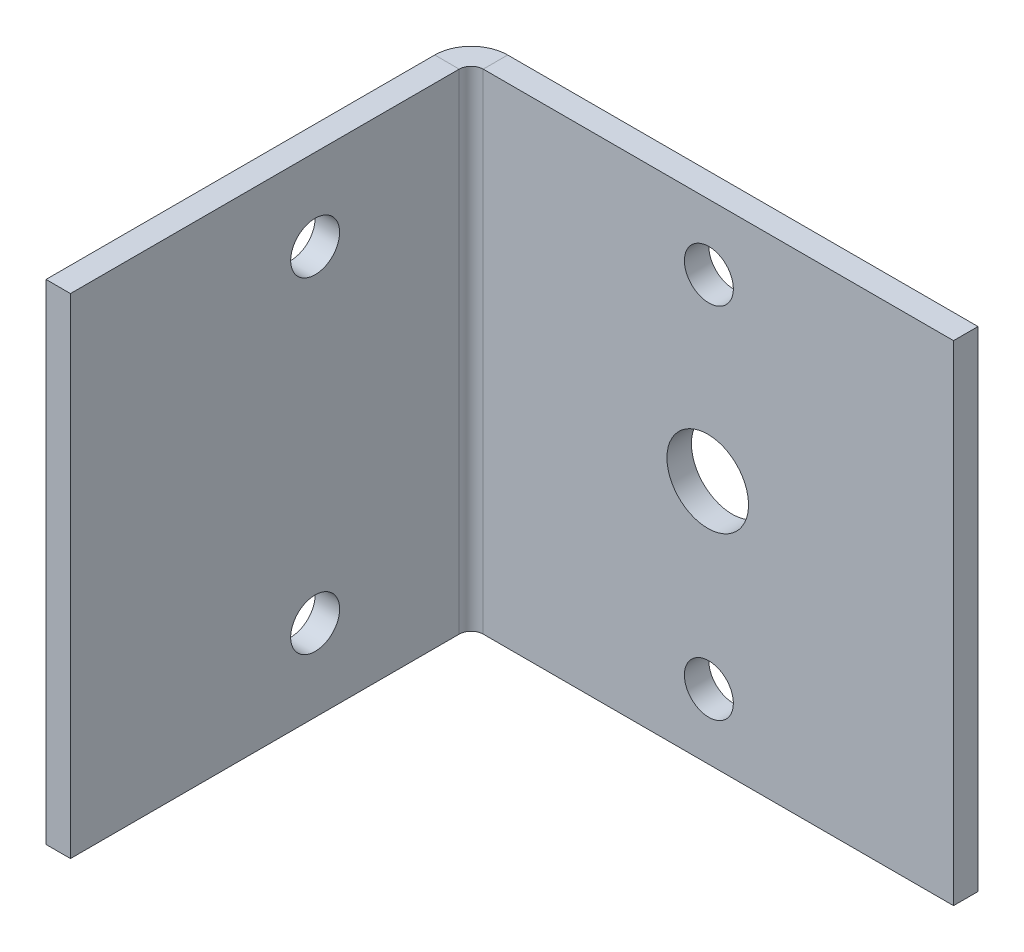
ISO-10303-21;
HEADER;
FILE_DESCRIPTION(('STEP AP214'),'2;1');
FILE_NAME('part.step','',(''),(''),'','','');
FILE_SCHEMA(('AUTOMOTIVE_DESIGN { 1 0 10303 214 1 1 1 1 }'));
ENDSEC;
DATA;
#1=APPLICATION_CONTEXT('core data for automotive mechanical design processes');
#2=APPLICATION_PROTOCOL_DEFINITION('international standard','automotive_design',2000,#1);
#3=PRODUCT_CONTEXT('',#1,'mechanical');
#4=PRODUCT('Part','Part','',(#3));
#5=PRODUCT_RELATED_PRODUCT_CATEGORY('part','',(#4));
#6=PRODUCT_DEFINITION_FORMATION('','',#4);
#7=PRODUCT_DEFINITION_CONTEXT('part definition',#1,'design');
#8=PRODUCT_DEFINITION('design','',#6,#7);
#9=PRODUCT_DEFINITION_SHAPE('','',#8);
#10=(LENGTH_UNIT() NAMED_UNIT(*) SI_UNIT(.MILLI.,.METRE.));
#11=(NAMED_UNIT(*) PLANE_ANGLE_UNIT() SI_UNIT($,.RADIAN.));
#12=(NAMED_UNIT(*) SI_UNIT($,.STERADIAN.) SOLID_ANGLE_UNIT());
#13=UNCERTAINTY_MEASURE_WITH_UNIT(LENGTH_MEASURE(1.E-05),#10,'distance_accuracy_value','');
#14=(GEOMETRIC_REPRESENTATION_CONTEXT(3) GLOBAL_UNCERTAINTY_ASSIGNED_CONTEXT((#13)) GLOBAL_UNIT_ASSIGNED_CONTEXT((#10,
#11,#12)) REPRESENTATION_CONTEXT('',''));
#15=CARTESIAN_POINT('',(0.,0.,0.));
#16=DIRECTION('',(0.,0.,1.));
#17=DIRECTION('',(1.,0.,0.));
#18=AXIS2_PLACEMENT_3D('',#15,#16,#17);
#19=CARTESIAN_POINT('',(23.9309729097067,30.,24.5690270902934));
#20=DIRECTION('',(0.,1.,0.));
#21=DIRECTION('',(1.,0.,0.));
#22=AXIS2_PLACEMENT_3D('',#19,#20,#21);
#23=PLANE('',#22);
#24=DIRECTION('',(0.,0.,1.));
#25=VECTOR('',#24,1.);
#26=CARTESIAN_POINT('',(25.4309729097067,30.,24.5690270902934));
#27=LINE('',#26,#25);
#28=CARTESIAN_POINT('',(25.4309729097067,30.,0.736600000000002));
#29=VERTEX_POINT('',#28);
#30=CARTESIAN_POINT('',(25.4309729097067,30.,24.5690270902934));
#31=VERTEX_POINT('',#30);
#32=EDGE_CURVE('E83',#29,#31,#27,.T.);
#33=ORIENTED_EDGE('',*,*,#32,.F.);
#34=DIRECTION('',(-1.,0.,0.));
#35=VECTOR('',#34,1.);
#36=CARTESIAN_POINT('',(23.9309729097067,30.,0.736600000000007));
#37=LINE('',#36,#35);
#38=CARTESIAN_POINT('',(23.9309729097067,30.,0.736600000000007));
#39=VERTEX_POINT('',#38);
#40=EDGE_CURVE('E114',#29,#39,#37,.T.);
#41=ORIENTED_EDGE('',*,*,#40,.T.);
#42=DIRECTION('',(0.,0.,1.));
#43=VECTOR('',#42,1.);
#44=CARTESIAN_POINT('',(23.9309729097067,30.,-0.430972909706635));
#45=LINE('',#44,#43);
#46=CARTESIAN_POINT('',(23.9309729097067,30.,24.5690270902934));
#47=VERTEX_POINT('',#46);
#48=EDGE_CURVE('E68',#39,#47,#45,.T.);
#49=ORIENTED_EDGE('',*,*,#48,.T.);
#50=DIRECTION('',(1.,0.,0.));
#51=VECTOR('',#50,1.);
#52=CARTESIAN_POINT('',(23.9309729097067,30.,24.5690270902934));
#53=LINE('',#52,#51);
#54=EDGE_CURVE('E93',#47,#31,#53,.T.);
#55=ORIENTED_EDGE('',*,*,#54,.T.);
#56=EDGE_LOOP('',(#33,#41,#49,#55));
#57=FACE_BOUND('',#56,.T.);
#58=ADVANCED_FACE('F42',(#57),#23,.T.);
#59=CARTESIAN_POINT('',(23.9309729097067,0.,-0.430972909706631));
#60=DIRECTION('',(0.,-1.,0.));
#61=DIRECTION('',(-1.,0.,0.));
#62=AXIS2_PLACEMENT_3D('',#59,#60,#61);
#63=PLANE('',#62);
#64=DIRECTION('',(0.,0.,-1.));
#65=VECTOR('',#64,1.);
#66=CARTESIAN_POINT('',(23.9309729097067,0.,24.5690270902934));
#67=LINE('',#66,#65);
#68=CARTESIAN_POINT('',(23.9309729097067,0.,24.5690270902934));
#69=VERTEX_POINT('',#68);
#70=CARTESIAN_POINT('',(23.9309729097067,0.,0.736600000000007));
#71=VERTEX_POINT('',#70);
#72=EDGE_CURVE('E117',#69,#71,#67,.T.);
#73=ORIENTED_EDGE('',*,*,#72,.T.);
#74=DIRECTION('',(1.,0.,0.));
#75=VECTOR('',#74,1.);
#76=CARTESIAN_POINT('',(23.9309729097067,0.,0.736600000000007));
#77=LINE('',#76,#75);
#78=CARTESIAN_POINT('',(25.4309729097067,0.,0.736600000000002));
#79=VERTEX_POINT('',#78);
#80=EDGE_CURVE('E12',#71,#79,#77,.T.);
#81=ORIENTED_EDGE('',*,*,#80,.T.);
#82=DIRECTION('',(0.,0.,-1.));
#83=VECTOR('',#82,1.);
#84=CARTESIAN_POINT('',(25.4309729097067,0.,-0.430972909706638));
#85=LINE('',#84,#83);
#86=CARTESIAN_POINT('',(25.4309729097067,0.,24.5690270902934));
#87=VERTEX_POINT('',#86);
#88=EDGE_CURVE('E91',#87,#79,#85,.T.);
#89=ORIENTED_EDGE('',*,*,#88,.F.);
#90=DIRECTION('',(1.,0.,0.));
#91=VECTOR('',#90,1.);
#92=CARTESIAN_POINT('',(23.9309729097067,0.,24.5690270902934));
#93=LINE('',#92,#91);
#94=EDGE_CURVE('E98',#69,#87,#93,.T.);
#95=ORIENTED_EDGE('',*,*,#94,.F.);
#96=EDGE_LOOP('',(#73,#81,#89,#95));
#97=FACE_BOUND('',#96,.T.);
#98=ADVANCED_FACE('F44',(#97),#63,.T.);
#99=CARTESIAN_POINT('',(23.9309729097067,0.,24.5690270902934));
#100=DIRECTION('',(-1.,0.,0.));
#101=DIRECTION('',(0.,0.,1.));
#102=AXIS2_PLACEMENT_3D('',#99,#100,#101);
#103=PLANE('',#102);
#104=CARTESIAN_POINT('',(23.9309729097066,5.,9.56902709029336));
#105=DIRECTION('',(1.,0.,0.));
#106=DIRECTION('',(0.,0.,-1.));
#107=AXIS2_PLACEMENT_3D('',#104,#105,#106);
#108=CIRCLE('',#107,1.5);
#109=CARTESIAN_POINT('',(23.9309729097066,5.,8.06902709029336));
#110=VERTEX_POINT('',#109);
#111=EDGE_CURVE('E252',#110,#110,#108,.T.);
#112=ORIENTED_EDGE('',*,*,#111,.T.);
#113=EDGE_LOOP('',(#112));
#114=FACE_BOUND('',#113,.T.);
#115=CARTESIAN_POINT('',(23.9309729097066,25.,9.56902709029336));
#116=DIRECTION('',(1.,0.,0.));
#117=DIRECTION('',(0.,0.,-1.));
#118=AXIS2_PLACEMENT_3D('',#115,#116,#117);
#119=CIRCLE('',#118,1.5);
#120=CARTESIAN_POINT('',(23.9309729097066,25.,8.06902709029336));
#121=VERTEX_POINT('',#120);
#122=EDGE_CURVE('E251',#121,#121,#119,.T.);
#123=ORIENTED_EDGE('',*,*,#122,.T.);
#124=EDGE_LOOP('',(#123));
#125=FACE_BOUND('',#124,.T.);
#126=ORIENTED_EDGE('',*,*,#48,.F.);
#127=DIRECTION('',(0.,-1.,0.));
#128=VECTOR('',#127,1.);
#129=CARTESIAN_POINT('',(23.9309729097067,0.,0.736600000000007));
#130=LINE('',#129,#128);
#131=EDGE_CURVE('E97',#39,#71,#130,.T.);
#132=ORIENTED_EDGE('',*,*,#131,.T.);
#133=ORIENTED_EDGE('',*,*,#72,.F.);
#134=DIRECTION('',(0.,-1.,0.));
#135=VECTOR('',#134,1.);
#136=CARTESIAN_POINT('',(23.9309729097067,0.,24.5690270902934));
#137=LINE('',#136,#135);
#138=EDGE_CURVE('E90',#47,#69,#137,.T.);
#139=ORIENTED_EDGE('',*,*,#138,.F.);
#140=EDGE_LOOP('',(#126,#132,#133,#139));
#141=FACE_BOUND('',#140,.T.);
#142=ADVANCED_FACE('F122',(#114,#125,#141),#103,.T.);
#143=CARTESIAN_POINT('',(23.9309729097067,0.,24.5690270902934));
#144=DIRECTION('',(0.,0.,1.));
#145=DIRECTION('',(1.,0.,0.));
#146=AXIS2_PLACEMENT_3D('',#143,#144,#145);
#147=PLANE('',#146);
#148=DIRECTION('',(0.,-1.,0.));
#149=VECTOR('',#148,1.);
#150=CARTESIAN_POINT('',(25.4309729097067,0.,24.5690270902934));
#151=LINE('',#150,#149);
#152=EDGE_CURVE('E87',#31,#87,#151,.T.);
#153=ORIENTED_EDGE('',*,*,#152,.F.);
#154=ORIENTED_EDGE('',*,*,#54,.F.);
#155=ORIENTED_EDGE('',*,*,#138,.T.);
#156=ORIENTED_EDGE('',*,*,#94,.T.);
#157=EDGE_LOOP('',(#153,#154,#155,#156));
#158=FACE_BOUND('',#157,.T.);
#159=ADVANCED_FACE('F101',(#158),#147,.T.);
#160=CARTESIAN_POINT('',(25.4309729097067,0.,24.5690270902934));
#161=DIRECTION('',(-1.,0.,0.));
#162=DIRECTION('',(0.,0.,1.));
#163=AXIS2_PLACEMENT_3D('',#160,#161,#162);
#164=PLANE('',#163);
#165=CARTESIAN_POINT('',(25.4309729097067,5.,9.56902709029336));
#166=DIRECTION('',(1.,0.,0.));
#167=DIRECTION('',(0.,0.,-1.));
#168=AXIS2_PLACEMENT_3D('',#165,#166,#167);
#169=CIRCLE('',#168,1.49999999999999);
#170=CARTESIAN_POINT('',(25.4309729097067,5.,8.06902709029337));
#171=VERTEX_POINT('',#170);
#172=EDGE_CURVE('E246',#171,#171,#169,.T.);
#173=ORIENTED_EDGE('',*,*,#172,.F.);
#174=EDGE_LOOP('',(#173));
#175=FACE_BOUND('',#174,.T.);
#176=CARTESIAN_POINT('',(25.4309729097067,25.,9.56902709029336));
#177=DIRECTION('',(1.,0.,0.));
#178=DIRECTION('',(0.,0.,-1.));
#179=AXIS2_PLACEMENT_3D('',#176,#177,#178);
#180=CIRCLE('',#179,1.49999999999999);
#181=CARTESIAN_POINT('',(25.4309729097067,25.,8.06902709029337));
#182=VERTEX_POINT('',#181);
#183=EDGE_CURVE('E249',#182,#182,#180,.T.);
#184=ORIENTED_EDGE('',*,*,#183,.F.);
#185=EDGE_LOOP('',(#184));
#186=FACE_BOUND('',#185,.T.);
#187=DIRECTION('',(0.,-1.,0.));
#188=VECTOR('',#187,1.);
#189=CARTESIAN_POINT('',(25.4309729097067,0.,0.7366));
#190=LINE('',#189,#188);
#191=EDGE_CURVE('E51',#29,#79,#190,.T.);
#192=ORIENTED_EDGE('',*,*,#191,.F.);
#193=ORIENTED_EDGE('',*,*,#32,.T.);
#194=ORIENTED_EDGE('',*,*,#152,.T.);
#195=ORIENTED_EDGE('',*,*,#88,.T.);
#196=EDGE_LOOP('',(#192,#193,#194,#195));
#197=FACE_BOUND('',#196,.T.);
#198=ADVANCED_FACE('F84',(#175,#186,#197),#164,.F.);
#199=CARTESIAN_POINT('',(55.,0.,-1.5));
#200=DIRECTION('',(1.,0.,0.));
#201=DIRECTION('',(0.,0.,-1.));
#202=AXIS2_PLACEMENT_3D('',#199,#200,#201);
#203=PLANE('',#202);
#204=DIRECTION('',(0.,1.,0.));
#205=VECTOR('',#204,1.);
#206=CARTESIAN_POINT('',(55.,0.,0.));
#207=LINE('',#206,#205);
#208=CARTESIAN_POINT('',(55.,0.,0.));
#209=VERTEX_POINT('',#208);
#210=CARTESIAN_POINT('',(55.,30.,0.));
#211=VERTEX_POINT('',#210);
#212=EDGE_CURVE('E152',#209,#211,#207,.T.);
#213=ORIENTED_EDGE('',*,*,#212,.F.);
#214=DIRECTION('',(0.,0.,1.));
#215=VECTOR('',#214,1.);
#216=CARTESIAN_POINT('',(55.,0.,-1.5));
#217=LINE('',#216,#215);
#218=CARTESIAN_POINT('',(55.,0.,-1.5));
#219=VERTEX_POINT('',#218);
#220=EDGE_CURVE('E102',#219,#209,#217,.T.);
#221=ORIENTED_EDGE('',*,*,#220,.F.);
#222=DIRECTION('',(0.,1.,0.));
#223=VECTOR('',#222,1.);
#224=CARTESIAN_POINT('',(55.,0.,-1.5));
#225=LINE('',#224,#223);
#226=CARTESIAN_POINT('',(55.,30.,-1.5));
#227=VERTEX_POINT('',#226);
#228=EDGE_CURVE('E170',#219,#227,#225,.T.);
#229=ORIENTED_EDGE('',*,*,#228,.T.);
#230=DIRECTION('',(0.,0.,1.));
#231=VECTOR('',#230,1.);
#232=CARTESIAN_POINT('',(55.,30.,-1.5));
#233=LINE('',#232,#231);
#234=EDGE_CURVE('E167',#227,#211,#233,.T.);
#235=ORIENTED_EDGE('',*,*,#234,.T.);
#236=EDGE_LOOP('',(#213,#221,#229,#235));
#237=FACE_BOUND('',#236,.T.);
#238=ADVANCED_FACE('F232',(#237),#203,.T.);
#239=CARTESIAN_POINT('',(0.,0.,-1.5));
#240=DIRECTION('',(0.,0.,-1.));
#241=DIRECTION('',(-1.,0.,0.));
#242=AXIS2_PLACEMENT_3D('',#239,#240,#241);
#243=PLANE('',#242);
#244=CARTESIAN_POINT('',(40.,4.,-1.5));
#245=DIRECTION('',(0.,0.,-1.));
#246=DIRECTION('',(-1.,0.,0.));
#247=AXIS2_PLACEMENT_3D('',#244,#245,#246);
#248=CIRCLE('',#247,1.5);
#249=CARTESIAN_POINT('',(38.5,4.,-1.5));
#250=VERTEX_POINT('',#249);
#251=EDGE_CURVE('E255',#250,#250,#248,.T.);
#252=ORIENTED_EDGE('',*,*,#251,.F.);
#253=EDGE_LOOP('',(#252));
#254=FACE_BOUND('',#253,.T.);
#255=CARTESIAN_POINT('',(40.,26.,-1.5));
#256=DIRECTION('',(0.,0.,-1.));
#257=DIRECTION('',(-1.,0.,0.));
#258=AXIS2_PLACEMENT_3D('',#255,#256,#257);
#259=CIRCLE('',#258,1.5);
#260=CARTESIAN_POINT('',(38.5,26.,-1.5));
#261=VERTEX_POINT('',#260);
#262=EDGE_CURVE('E263',#261,#261,#259,.T.);
#263=ORIENTED_EDGE('',*,*,#262,.F.);
#264=EDGE_LOOP('',(#263));
#265=FACE_BOUND('',#264,.T.);
#266=CARTESIAN_POINT('',(39.9309729097067,15.,-1.5));
#267=DIRECTION('',(0.,0.,-1.));
#268=DIRECTION('',(-1.,0.,0.));
#269=AXIS2_PLACEMENT_3D('',#266,#267,#268);
#270=CIRCLE('',#269,2.49999999999999);
#271=CARTESIAN_POINT('',(37.4309729097067,15.,-1.5));
#272=VERTEX_POINT('',#271);
#273=EDGE_CURVE('E268',#272,#272,#270,.T.);
#274=ORIENTED_EDGE('',*,*,#273,.F.);
#275=EDGE_LOOP('',(#274));
#276=FACE_BOUND('',#275,.T.);
#277=DIRECTION('',(0.,-1.,0.));
#278=VECTOR('',#277,1.);
#279=CARTESIAN_POINT('',(26.1675729097067,0.,-1.5));
#280=LINE('',#279,#278);
#281=CARTESIAN_POINT('',(26.1675729097066,30.,-1.5));
#282=VERTEX_POINT('',#281);
#283=CARTESIAN_POINT('',(26.1675729097066,0.,-1.5));
#284=VERTEX_POINT('',#283);
#285=EDGE_CURVE('E140',#282,#284,#280,.T.);
#286=ORIENTED_EDGE('',*,*,#285,.F.);
#287=DIRECTION('',(-1.,0.,0.));
#288=VECTOR('',#287,1.);
#289=CARTESIAN_POINT('',(25.,30.,-1.5));
#290=LINE('',#289,#288);
#291=EDGE_CURVE('E164',#227,#282,#290,.T.);
#292=ORIENTED_EDGE('',*,*,#291,.F.);
#293=ORIENTED_EDGE('',*,*,#228,.F.);
#294=DIRECTION('',(1.,0.,0.));
#295=VECTOR('',#294,1.);
#296=CARTESIAN_POINT('',(0.,0.,-1.5));
#297=LINE('',#296,#295);
#298=EDGE_CURVE('E106',#284,#219,#297,.T.);
#299=ORIENTED_EDGE('',*,*,#298,.F.);
#300=EDGE_LOOP('',(#286,#292,#293,#299));
#301=FACE_BOUND('',#300,.T.);
#302=ADVANCED_FACE('F239',(#254,#265,#276,#301),#243,.T.);
#303=CARTESIAN_POINT('',(0.,30.,-1.5));
#304=DIRECTION('',(0.,1.,0.));
#305=DIRECTION('',(0.,0.,1.));
#306=AXIS2_PLACEMENT_3D('',#303,#304,#305);
#307=PLANE('',#306);
#308=DIRECTION('',(0.,0.,-1.));
#309=VECTOR('',#308,1.);
#310=CARTESIAN_POINT('',(26.1675729097066,30.,-1.5));
#311=LINE('',#310,#309);
#312=CARTESIAN_POINT('',(26.1675729097066,30.,0.));
#313=VERTEX_POINT('',#312);
#314=EDGE_CURVE('E137',#313,#282,#311,.T.);
#315=ORIENTED_EDGE('',*,*,#314,.F.);
#316=DIRECTION('',(-1.,0.,0.));
#317=VECTOR('',#316,1.);
#318=CARTESIAN_POINT('',(0.,30.,0.));
#319=LINE('',#318,#317);
#320=EDGE_CURVE('E161',#211,#313,#319,.T.);
#321=ORIENTED_EDGE('',*,*,#320,.F.);
#322=ORIENTED_EDGE('',*,*,#234,.F.);
#323=ORIENTED_EDGE('',*,*,#291,.T.);
#324=EDGE_LOOP('',(#315,#321,#322,#323));
#325=FACE_BOUND('',#324,.T.);
#326=ADVANCED_FACE('F276',(#325),#307,.T.);
#327=CARTESIAN_POINT('',(0.,0.,0.));
#328=DIRECTION('',(0.,0.,-1.));
#329=DIRECTION('',(-1.,0.,0.));
#330=AXIS2_PLACEMENT_3D('',#327,#328,#329);
#331=PLANE('',#330);
#332=CARTESIAN_POINT('',(40.,4.,0.));
#333=DIRECTION('',(0.,0.,-1.));
#334=DIRECTION('',(-1.,0.,0.));
#335=AXIS2_PLACEMENT_3D('',#332,#333,#334);
#336=CIRCLE('',#335,1.5);
#337=CARTESIAN_POINT('',(38.5,4.,0.));
#338=VERTEX_POINT('',#337);
#339=EDGE_CURVE('E46',#338,#338,#336,.T.);
#340=ORIENTED_EDGE('',*,*,#339,.T.);
#341=EDGE_LOOP('',(#340));
#342=FACE_BOUND('',#341,.T.);
#343=CARTESIAN_POINT('',(40.,26.,0.));
#344=DIRECTION('',(0.,0.,-1.));
#345=DIRECTION('',(-1.,0.,0.));
#346=AXIS2_PLACEMENT_3D('',#343,#344,#345);
#347=CIRCLE('',#346,1.5);
#348=CARTESIAN_POINT('',(38.5,26.,0.));
#349=VERTEX_POINT('',#348);
#350=EDGE_CURVE('E266',#349,#349,#347,.T.);
#351=ORIENTED_EDGE('',*,*,#350,.T.);
#352=EDGE_LOOP('',(#351));
#353=FACE_BOUND('',#352,.T.);
#354=CARTESIAN_POINT('',(39.9309729097067,15.,0.));
#355=DIRECTION('',(0.,0.,-1.));
#356=DIRECTION('',(-1.,0.,0.));
#357=AXIS2_PLACEMENT_3D('',#354,#355,#356);
#358=CIRCLE('',#357,2.49999999999999);
#359=CARTESIAN_POINT('',(37.4309729097067,15.,0.));
#360=VERTEX_POINT('',#359);
#361=EDGE_CURVE('E146',#360,#360,#358,.T.);
#362=ORIENTED_EDGE('',*,*,#361,.T.);
#363=EDGE_LOOP('',(#362));
#364=FACE_BOUND('',#363,.T.);
#365=ORIENTED_EDGE('',*,*,#320,.T.);
#366=DIRECTION('',(0.,-1.,0.));
#367=VECTOR('',#366,1.);
#368=CARTESIAN_POINT('',(26.1675729097067,0.,0.));
#369=LINE('',#368,#367);
#370=CARTESIAN_POINT('',(26.1675729097066,0.,0.));
#371=VERTEX_POINT('',#370);
#372=EDGE_CURVE('E158',#313,#371,#369,.T.);
#373=ORIENTED_EDGE('',*,*,#372,.T.);
#374=DIRECTION('',(1.,0.,0.));
#375=VECTOR('',#374,1.);
#376=CARTESIAN_POINT('',(25.,0.,0.));
#377=LINE('',#376,#375);
#378=EDGE_CURVE('E155',#371,#209,#377,.T.);
#379=ORIENTED_EDGE('',*,*,#378,.T.);
#380=ORIENTED_EDGE('',*,*,#212,.T.);
#381=EDGE_LOOP('',(#365,#373,#379,#380));
#382=FACE_BOUND('',#381,.T.);
#383=ADVANCED_FACE('F210',(#342,#353,#364,#382),#331,.F.);
#384=CARTESIAN_POINT('',(25.,0.,-1.5));
#385=DIRECTION('',(0.,-1.,0.));
#386=DIRECTION('',(0.,0.,-1.));
#387=AXIS2_PLACEMENT_3D('',#384,#385,#386);
#388=PLANE('',#387);
#389=DIRECTION('',(0.,0.,1.));
#390=VECTOR('',#389,1.);
#391=CARTESIAN_POINT('',(26.1675729097067,0.,-1.5));
#392=LINE('',#391,#390);
#393=EDGE_CURVE('E174',#284,#371,#392,.T.);
#394=ORIENTED_EDGE('',*,*,#393,.F.);
#395=ORIENTED_EDGE('',*,*,#298,.T.);
#396=ORIENTED_EDGE('',*,*,#220,.T.);
#397=ORIENTED_EDGE('',*,*,#378,.F.);
#398=EDGE_LOOP('',(#394,#395,#396,#397));
#399=FACE_BOUND('',#398,.T.);
#400=ADVANCED_FACE('F205',(#399),#388,.T.);
#401=CARTESIAN_POINT('',(26.1675729097066,30.,0.7366));
#402=DIRECTION('',(0.,1.,0.));
#403=DIRECTION('',(0.,0.,1.));
#404=AXIS2_PLACEMENT_3D('',#401,#402,#403);
#405=PLANE('',#404);
#406=ORIENTED_EDGE('',*,*,#40,.F.);
#407=CARTESIAN_POINT('',(26.1675729097066,30.,0.7366));
#408=DIRECTION('',(0.,1.,0.));
#409=DIRECTION('',(-1.,0.,0.));
#410=AXIS2_PLACEMENT_3D('',#407,#408,#409);
#411=CIRCLE('',#410,0.7366);
#412=EDGE_CURVE('E143',#29,#313,#411,.F.);
#413=ORIENTED_EDGE('',*,*,#412,.T.);
#414=ORIENTED_EDGE('',*,*,#314,.T.);
#415=CARTESIAN_POINT('',(26.1675729097066,30.,0.7366));
#416=DIRECTION('',(0.,-1.,0.));
#417=DIRECTION('',(0.,0.,1.));
#418=AXIS2_PLACEMENT_3D('',#415,#416,#417);
#419=CIRCLE('',#418,2.2366);
#420=EDGE_CURVE('E128',#39,#282,#419,.T.);
#421=ORIENTED_EDGE('',*,*,#420,.F.);
#422=EDGE_LOOP('',(#406,#413,#414,#421));
#423=FACE_BOUND('',#422,.T.);
#424=ADVANCED_FACE('F133',(#423),#405,.T.);
#425=CARTESIAN_POINT('',(26.1675729097067,0.,0.7366));
#426=DIRECTION('',(0.,-1.,0.));
#427=DIRECTION('',(1.,0.,0.));
#428=AXIS2_PLACEMENT_3D('',#425,#426,#427);
#429=PLANE('',#428);
#430=CARTESIAN_POINT('',(26.1675729097067,0.,0.7366));
#431=DIRECTION('',(0.,1.,0.));
#432=DIRECTION('',(-1.,0.,0.));
#433=AXIS2_PLACEMENT_3D('',#430,#431,#432);
#434=CIRCLE('',#433,0.7366);
#435=EDGE_CURVE('E138',#371,#79,#434,.T.);
#436=ORIENTED_EDGE('',*,*,#435,.T.);
#437=ORIENTED_EDGE('',*,*,#80,.F.);
#438=CARTESIAN_POINT('',(26.1675729097067,0.,0.7366));
#439=DIRECTION('',(0.,1.,0.));
#440=DIRECTION('',(1.,0.,0.));
#441=AXIS2_PLACEMENT_3D('',#438,#439,#440);
#442=CIRCLE('',#441,2.2366);
#443=EDGE_CURVE('E59',#284,#71,#442,.T.);
#444=ORIENTED_EDGE('',*,*,#443,.F.);
#445=ORIENTED_EDGE('',*,*,#393,.T.);
#446=EDGE_LOOP('',(#436,#437,#444,#445));
#447=FACE_BOUND('',#446,.T.);
#448=ADVANCED_FACE('F183',(#447),#429,.T.);
#449=CARTESIAN_POINT('',(26.1675729097067,-15.1281082379549,0.7366));
#450=DIRECTION('',(0.,1.,0.));
#451=DIRECTION('',(-1.,0.,0.));
#452=AXIS2_PLACEMENT_3D('',#449,#450,#451);
#453=CYLINDRICAL_SURFACE('',#452,2.2366);
#454=ORIENTED_EDGE('',*,*,#285,.T.);
#455=ORIENTED_EDGE('',*,*,#443,.T.);
#456=ORIENTED_EDGE('',*,*,#131,.F.);
#457=ORIENTED_EDGE('',*,*,#420,.T.);
#458=EDGE_LOOP('',(#454,#455,#456,#457));
#459=FACE_BOUND('',#458,.T.);
#460=ADVANCED_FACE('F126',(#459),#453,.T.);
#461=CARTESIAN_POINT('',(26.1675729097067,-15.1281082379549,0.7366));
#462=DIRECTION('',(0.,1.,0.));
#463=DIRECTION('',(-1.,0.,0.));
#464=AXIS2_PLACEMENT_3D('',#461,#462,#463);
#465=CYLINDRICAL_SURFACE('',#464,0.7366);
#466=ORIENTED_EDGE('',*,*,#372,.F.);
#467=ORIENTED_EDGE('',*,*,#412,.F.);
#468=ORIENTED_EDGE('',*,*,#191,.T.);
#469=ORIENTED_EDGE('',*,*,#435,.F.);
#470=EDGE_LOOP('',(#466,#467,#468,#469));
#471=FACE_BOUND('',#470,.T.);
#472=ADVANCED_FACE('F211',(#471),#465,.F.);
#473=CARTESIAN_POINT('',(39.9309729097067,15.,-1.5));
#474=DIRECTION('',(0.,0.,-1.));
#475=DIRECTION('',(-1.,0.,0.));
#476=AXIS2_PLACEMENT_3D('',#473,#474,#475);
#477=CYLINDRICAL_SURFACE('',#476,2.49999999999999);
#478=ORIENTED_EDGE('',*,*,#273,.T.);
#479=EDGE_LOOP('',(#478));
#480=FACE_BOUND('',#479,.T.);
#481=ORIENTED_EDGE('',*,*,#361,.F.);
#482=EDGE_LOOP('',(#481));
#483=FACE_BOUND('',#482,.T.);
#484=ADVANCED_FACE('F213',(#480,#483),#477,.F.);
#485=CARTESIAN_POINT('',(40.,26.,-1.5));
#486=DIRECTION('',(0.,0.,-1.));
#487=DIRECTION('',(-1.,0.,0.));
#488=AXIS2_PLACEMENT_3D('',#485,#486,#487);
#489=CYLINDRICAL_SURFACE('',#488,1.5);
#490=ORIENTED_EDGE('',*,*,#262,.T.);
#491=EDGE_LOOP('',(#490));
#492=FACE_BOUND('',#491,.T.);
#493=ORIENTED_EDGE('',*,*,#350,.F.);
#494=EDGE_LOOP('',(#493));
#495=FACE_BOUND('',#494,.T.);
#496=ADVANCED_FACE('F219',(#492,#495),#489,.F.);
#497=CARTESIAN_POINT('',(40.,4.,-1.5));
#498=DIRECTION('',(0.,0.,-1.));
#499=DIRECTION('',(-1.,0.,0.));
#500=AXIS2_PLACEMENT_3D('',#497,#498,#499);
#501=CYLINDRICAL_SURFACE('',#500,1.5);
#502=ORIENTED_EDGE('',*,*,#251,.T.);
#503=EDGE_LOOP('',(#502));
#504=FACE_BOUND('',#503,.T.);
#505=ORIENTED_EDGE('',*,*,#339,.F.);
#506=EDGE_LOOP('',(#505));
#507=FACE_BOUND('',#506,.T.);
#508=ADVANCED_FACE('F342',(#504,#507),#501,.F.);
#509=CARTESIAN_POINT('',(25.4309729097067,25.,9.56902709029336));
#510=DIRECTION('',(1.,0.,0.));
#511=DIRECTION('',(0.,0.,-1.));
#512=AXIS2_PLACEMENT_3D('',#509,#510,#511);
#513=CYLINDRICAL_SURFACE('',#512,1.49999999999999);
#514=ORIENTED_EDGE('',*,*,#122,.F.);
#515=EDGE_LOOP('',(#514));
#516=FACE_BOUND('',#515,.T.);
#517=ORIENTED_EDGE('',*,*,#183,.T.);
#518=EDGE_LOOP('',(#517));
#519=FACE_BOUND('',#518,.T.);
#520=ADVANCED_FACE('F351',(#516,#519),#513,.F.);
#521=CARTESIAN_POINT('',(25.4309729097067,5.,9.56902709029336));
#522=DIRECTION('',(1.,0.,0.));
#523=DIRECTION('',(0.,0.,-1.));
#524=AXIS2_PLACEMENT_3D('',#521,#522,#523);
#525=CYLINDRICAL_SURFACE('',#524,1.49999999999999);
#526=ORIENTED_EDGE('',*,*,#111,.F.);
#527=EDGE_LOOP('',(#526));
#528=FACE_BOUND('',#527,.T.);
#529=ORIENTED_EDGE('',*,*,#172,.T.);
#530=EDGE_LOOP('',(#529));
#531=FACE_BOUND('',#530,.T.);
#532=ADVANCED_FACE('F443',(#528,#531),#525,.F.);
#533=CLOSED_SHELL('',(#58,#98,#142,#159,#198,#238,#302,#326,#383,#400,#424,#448,#460,#472,#484,
#496,#508,#520,#532));
#534=MANIFOLD_SOLID_BREP('B2',#533);
#535=ADVANCED_BREP_SHAPE_REPRESENTATION('',(#18,#534),#14);
#536=SHAPE_DEFINITION_REPRESENTATION(#9,#535);
ENDSEC;
END-ISO-10303-21;
